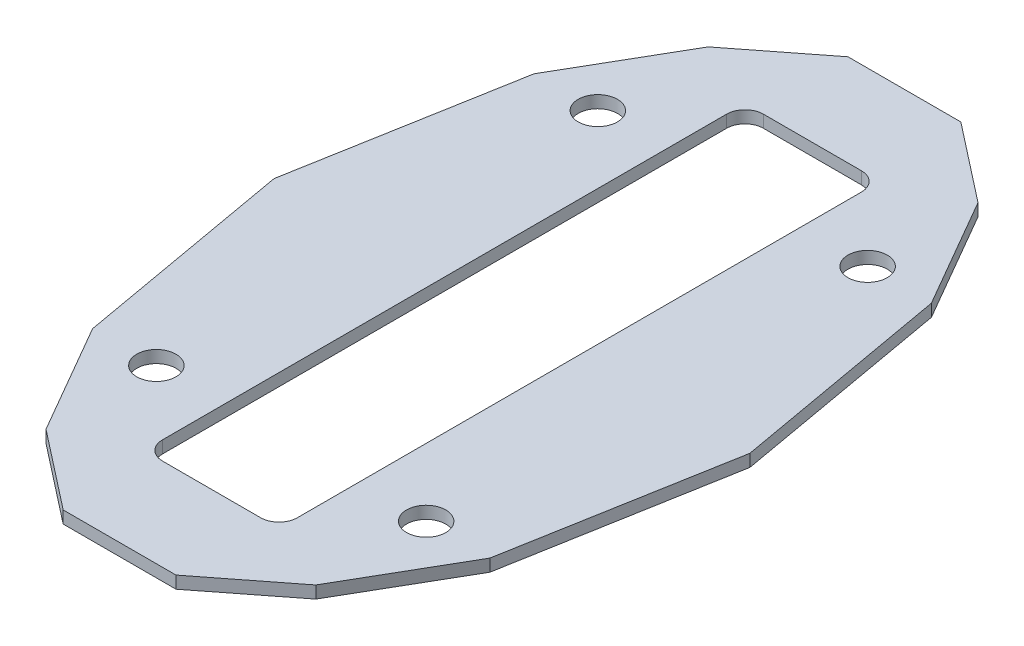
ISO-10303-21;
HEADER;
FILE_DESCRIPTION(('STEP AP214'),'2;1');
FILE_NAME('part.step','',(''),(''),'','','');
FILE_SCHEMA(('AUTOMOTIVE_DESIGN { 1 0 10303 214 1 1 1 1 }'));
ENDSEC;
DATA;
#1=APPLICATION_CONTEXT('core data for automotive mechanical design processes');
#2=APPLICATION_PROTOCOL_DEFINITION('international standard','automotive_design',2000,#1);
#3=PRODUCT_CONTEXT('',#1,'mechanical');
#4=PRODUCT('Part','Part','',(#3));
#5=PRODUCT_RELATED_PRODUCT_CATEGORY('part','',(#4));
#6=PRODUCT_DEFINITION_FORMATION('','',#4);
#7=PRODUCT_DEFINITION_CONTEXT('part definition',#1,'design');
#8=PRODUCT_DEFINITION('design','',#6,#7);
#9=PRODUCT_DEFINITION_SHAPE('','',#8);
#10=(LENGTH_UNIT() NAMED_UNIT(*) SI_UNIT(.MILLI.,.METRE.));
#11=(NAMED_UNIT(*) PLANE_ANGLE_UNIT() SI_UNIT($,.RADIAN.));
#12=(NAMED_UNIT(*) SI_UNIT($,.STERADIAN.) SOLID_ANGLE_UNIT());
#13=UNCERTAINTY_MEASURE_WITH_UNIT(LENGTH_MEASURE(1.E-05),#10,'distance_accuracy_value','');
#14=(GEOMETRIC_REPRESENTATION_CONTEXT(3) GLOBAL_UNCERTAINTY_ASSIGNED_CONTEXT((#13)) GLOBAL_UNIT_ASSIGNED_CONTEXT((#10,
#11,#12)) REPRESENTATION_CONTEXT('',''));
#15=CARTESIAN_POINT('',(0.,0.,0.));
#16=DIRECTION('',(0.,0.,1.));
#17=DIRECTION('',(1.,0.,0.));
#18=AXIS2_PLACEMENT_3D('',#15,#16,#17);
#19=CARTESIAN_POINT('',(19.4,1.,0.));
#20=DIRECTION('',(-0.984562507785907,0.,-0.175033334717494));
#21=DIRECTION('',(-0.175033334717494,0.,0.984562507785907));
#22=AXIS2_PLACEMENT_3D('',#19,#20,#21);
#23=PLANE('',#22);
#24=DIRECTION('',(0.175033334717494,0.,-0.984562507785907));
#25=VECTOR('',#24,1.);
#26=CARTESIAN_POINT('',(19.4,0.,0.));
#27=LINE('',#26,#25);
#28=CARTESIAN_POINT('',(16.2,0.,18.));
#29=VERTEX_POINT('',#28);
#30=CARTESIAN_POINT('',(19.4,0.,0.));
#31=VERTEX_POINT('',#30);
#32=EDGE_CURVE('E206',#29,#31,#27,.T.);
#33=ORIENTED_EDGE('',*,*,#32,.T.);
#34=DIRECTION('',(0.,-1.,0.));
#35=VECTOR('',#34,1.);
#36=CARTESIAN_POINT('',(19.4,1.,0.));
#37=LINE('',#36,#35);
#38=CARTESIAN_POINT('',(19.4,1.,0.));
#39=VERTEX_POINT('',#38);
#40=EDGE_CURVE('E187',#39,#31,#37,.T.);
#41=ORIENTED_EDGE('',*,*,#40,.F.);
#42=DIRECTION('',(0.175033334717494,0.,-0.984562507785907));
#43=VECTOR('',#42,1.);
#44=CARTESIAN_POINT('',(19.4,1.,0.));
#45=LINE('',#44,#43);
#46=CARTESIAN_POINT('',(16.2,1.,18.));
#47=VERTEX_POINT('',#46);
#48=EDGE_CURVE('E194',#47,#39,#45,.T.);
#49=ORIENTED_EDGE('',*,*,#48,.F.);
#50=DIRECTION('',(0.,-1.,0.));
#51=VECTOR('',#50,1.);
#52=CARTESIAN_POINT('',(16.2,1.,18.));
#53=LINE('',#52,#51);
#54=EDGE_CURVE('E300',#47,#29,#53,.T.);
#55=ORIENTED_EDGE('',*,*,#54,.T.);
#56=EDGE_LOOP('',(#33,#41,#49,#55));
#57=FACE_BOUND('',#56,.T.);
#58=ADVANCED_FACE('F34',(#57),#23,.F.);
#59=CARTESIAN_POINT('',(19.4,1.,0.));
#60=DIRECTION('',(-0.984562507785907,0.,0.175033334717494));
#61=DIRECTION('',(0.175033334717494,0.,0.984562507785907));
#62=AXIS2_PLACEMENT_3D('',#59,#60,#61);
#63=PLANE('',#62);
#64=DIRECTION('',(-0.175033334717494,0.,-0.984562507785907));
#65=VECTOR('',#64,1.);
#66=CARTESIAN_POINT('',(19.4,0.,0.));
#67=LINE('',#66,#65);
#68=CARTESIAN_POINT('',(16.2,0.,-18.));
#69=VERTEX_POINT('',#68);
#70=EDGE_CURVE('E302',#31,#69,#67,.T.);
#71=ORIENTED_EDGE('',*,*,#70,.T.);
#72=DIRECTION('',(0.,-1.,0.));
#73=VECTOR('',#72,1.);
#74=CARTESIAN_POINT('',(16.2,1.,-18.));
#75=LINE('',#74,#73);
#76=CARTESIAN_POINT('',(16.2,1.,-18.));
#77=VERTEX_POINT('',#76);
#78=EDGE_CURVE('E190',#77,#69,#75,.T.);
#79=ORIENTED_EDGE('',*,*,#78,.F.);
#80=DIRECTION('',(-0.175033334717494,0.,-0.984562507785907));
#81=VECTOR('',#80,1.);
#82=CARTESIAN_POINT('',(19.4,1.,0.));
#83=LINE('',#82,#81);
#84=EDGE_CURVE('E183',#39,#77,#83,.T.);
#85=ORIENTED_EDGE('',*,*,#84,.F.);
#86=ORIENTED_EDGE('',*,*,#40,.T.);
#87=EDGE_LOOP('',(#71,#79,#85,#86));
#88=FACE_BOUND('',#87,.T.);
#89=ADVANCED_FACE('F185',(#88),#63,.F.);
#90=CARTESIAN_POINT('',(16.2,1.,-18.));
#91=DIRECTION('',(-0.86586507324455,0.,0.50027759787463));
#92=DIRECTION('',(0.50027759787463,0.,0.86586507324455));
#93=AXIS2_PLACEMENT_3D('',#90,#91,#92);
#94=PLANE('',#93);
#95=DIRECTION('',(-0.50027759787463,0.,-0.86586507324455));
#96=VECTOR('',#95,1.);
#97=CARTESIAN_POINT('',(16.2,0.,-18.));
#98=LINE('',#97,#96);
#99=CARTESIAN_POINT('',(11.,0.,-27.));
#100=VERTEX_POINT('',#99);
#101=EDGE_CURVE('E304',#69,#100,#98,.T.);
#102=ORIENTED_EDGE('',*,*,#101,.T.);
#103=DIRECTION('',(0.,-1.,0.));
#104=VECTOR('',#103,1.);
#105=CARTESIAN_POINT('',(11.,1.,-27.));
#106=LINE('',#105,#104);
#107=CARTESIAN_POINT('',(11.,1.,-27.));
#108=VERTEX_POINT('',#107);
#109=EDGE_CURVE('E211',#108,#100,#106,.T.);
#110=ORIENTED_EDGE('',*,*,#109,.F.);
#111=DIRECTION('',(-0.50027759787463,0.,-0.86586507324455));
#112=VECTOR('',#111,1.);
#113=CARTESIAN_POINT('',(16.2,1.,-18.));
#114=LINE('',#113,#112);
#115=EDGE_CURVE('E193',#77,#108,#114,.T.);
#116=ORIENTED_EDGE('',*,*,#115,.F.);
#117=ORIENTED_EDGE('',*,*,#78,.T.);
#118=EDGE_LOOP('',(#102,#110,#116,#117));
#119=FACE_BOUND('',#118,.T.);
#120=ADVANCED_FACE('F381',(#119),#94,.F.);
#121=CARTESIAN_POINT('',(11.,1.,-27.));
#122=DIRECTION('',(-0.615644041972315,0.,0.788024373724563));
#123=DIRECTION('',(0.788024373724563,0.,0.615644041972315));
#124=AXIS2_PLACEMENT_3D('',#121,#122,#123);
#125=PLANE('',#124);
#126=DIRECTION('',(-0.788024373724563,0.,-0.615644041972315));
#127=VECTOR('',#126,1.);
#128=CARTESIAN_POINT('',(11.,0.,-27.));
#129=LINE('',#128,#127);
#130=CARTESIAN_POINT('',(4.6,0.,-32.));
#131=VERTEX_POINT('',#130);
#132=EDGE_CURVE('E306',#100,#131,#129,.T.);
#133=ORIENTED_EDGE('',*,*,#132,.T.);
#134=DIRECTION('',(0.,-1.,0.));
#135=VECTOR('',#134,1.);
#136=CARTESIAN_POINT('',(4.6,1.,-32.));
#137=LINE('',#136,#135);
#138=CARTESIAN_POINT('',(4.6,1.,-32.));
#139=VERTEX_POINT('',#138);
#140=EDGE_CURVE('E355',#139,#131,#137,.T.);
#141=ORIENTED_EDGE('',*,*,#140,.F.);
#142=DIRECTION('',(-0.788024373724563,0.,-0.615644041972315));
#143=VECTOR('',#142,1.);
#144=CARTESIAN_POINT('',(11.,1.,-27.));
#145=LINE('',#144,#143);
#146=EDGE_CURVE('E279',#108,#139,#145,.T.);
#147=ORIENTED_EDGE('',*,*,#146,.F.);
#148=ORIENTED_EDGE('',*,*,#109,.T.);
#149=EDGE_LOOP('',(#133,#141,#147,#148));
#150=FACE_BOUND('',#149,.T.);
#151=ADVANCED_FACE('F362',(#150),#125,.F.);
#152=CARTESIAN_POINT('',(4.6,1.,-32.));
#153=DIRECTION('',(0.,0.,1.));
#154=DIRECTION('',(1.,0.,0.));
#155=AXIS2_PLACEMENT_3D('',#152,#153,#154);
#156=PLANE('',#155);
#157=DIRECTION('',(-1.,0.,0.));
#158=VECTOR('',#157,1.);
#159=CARTESIAN_POINT('',(4.6,0.,-32.));
#160=LINE('',#159,#158);
#161=CARTESIAN_POINT('',(-4.6,0.,-32.));
#162=VERTEX_POINT('',#161);
#163=EDGE_CURVE('E308',#131,#162,#160,.T.);
#164=ORIENTED_EDGE('',*,*,#163,.T.);
#165=DIRECTION('',(0.,-1.,0.));
#166=VECTOR('',#165,1.);
#167=CARTESIAN_POINT('',(-4.6,1.,-32.));
#168=LINE('',#167,#166);
#169=CARTESIAN_POINT('',(-4.6,1.,-32.));
#170=VERTEX_POINT('',#169);
#171=EDGE_CURVE('E352',#170,#162,#168,.T.);
#172=ORIENTED_EDGE('',*,*,#171,.F.);
#173=DIRECTION('',(-1.,0.,0.));
#174=VECTOR('',#173,1.);
#175=CARTESIAN_POINT('',(4.6,1.,-32.));
#176=LINE('',#175,#174);
#177=EDGE_CURVE('E281',#139,#170,#176,.T.);
#178=ORIENTED_EDGE('',*,*,#177,.F.);
#179=ORIENTED_EDGE('',*,*,#140,.T.);
#180=EDGE_LOOP('',(#164,#172,#178,#179));
#181=FACE_BOUND('',#180,.T.);
#182=ADVANCED_FACE('F373',(#181),#156,.F.);
#183=CARTESIAN_POINT('',(-11.,1.,-27.));
#184=DIRECTION('',(0.615644041972315,0.,0.788024373724563));
#185=DIRECTION('',(0.788024373724563,0.,-0.615644041972315));
#186=AXIS2_PLACEMENT_3D('',#183,#184,#185);
#187=PLANE('',#186);
#188=DIRECTION('',(-0.788024373724563,0.,0.615644041972315));
#189=VECTOR('',#188,1.);
#190=CARTESIAN_POINT('',(-11.,0.,-27.));
#191=LINE('',#190,#189);
#192=CARTESIAN_POINT('',(-11.,0.,-27.));
#193=VERTEX_POINT('',#192);
#194=EDGE_CURVE('E310',#162,#193,#191,.T.);
#195=ORIENTED_EDGE('',*,*,#194,.T.);
#196=DIRECTION('',(0.,-1.,0.));
#197=VECTOR('',#196,1.);
#198=CARTESIAN_POINT('',(-11.,1.,-27.));
#199=LINE('',#198,#197);
#200=CARTESIAN_POINT('',(-11.,1.,-27.));
#201=VERTEX_POINT('',#200);
#202=EDGE_CURVE('E349',#201,#193,#199,.T.);
#203=ORIENTED_EDGE('',*,*,#202,.F.);
#204=DIRECTION('',(-0.788024373724563,0.,0.615644041972315));
#205=VECTOR('',#204,1.);
#206=CARTESIAN_POINT('',(-11.,1.,-27.));
#207=LINE('',#206,#205);
#208=EDGE_CURVE('E283',#170,#201,#207,.T.);
#209=ORIENTED_EDGE('',*,*,#208,.F.);
#210=ORIENTED_EDGE('',*,*,#171,.T.);
#211=EDGE_LOOP('',(#195,#203,#209,#210));
#212=FACE_BOUND('',#211,.T.);
#213=ADVANCED_FACE('F377',(#212),#187,.F.);
#214=CARTESIAN_POINT('',(-16.2,1.,-18.));
#215=DIRECTION('',(0.86586507324455,0.,0.50027759787463));
#216=DIRECTION('',(0.50027759787463,0.,-0.86586507324455));
#217=AXIS2_PLACEMENT_3D('',#214,#215,#216);
#218=PLANE('',#217);
#219=DIRECTION('',(-0.50027759787463,0.,0.86586507324455));
#220=VECTOR('',#219,1.);
#221=CARTESIAN_POINT('',(-16.2,0.,-18.));
#222=LINE('',#221,#220);
#223=CARTESIAN_POINT('',(-16.2,0.,-18.));
#224=VERTEX_POINT('',#223);
#225=EDGE_CURVE('E312',#193,#224,#222,.T.);
#226=ORIENTED_EDGE('',*,*,#225,.T.);
#227=DIRECTION('',(0.,-1.,0.));
#228=VECTOR('',#227,1.);
#229=CARTESIAN_POINT('',(-16.2,1.,-18.));
#230=LINE('',#229,#228);
#231=CARTESIAN_POINT('',(-16.2,1.,-18.));
#232=VERTEX_POINT('',#231);
#233=EDGE_CURVE('E346',#232,#224,#230,.T.);
#234=ORIENTED_EDGE('',*,*,#233,.F.);
#235=DIRECTION('',(-0.50027759787463,0.,0.86586507324455));
#236=VECTOR('',#235,1.);
#237=CARTESIAN_POINT('',(-16.2,1.,-18.));
#238=LINE('',#237,#236);
#239=EDGE_CURVE('E285',#201,#232,#238,.T.);
#240=ORIENTED_EDGE('',*,*,#239,.F.);
#241=ORIENTED_EDGE('',*,*,#202,.T.);
#242=EDGE_LOOP('',(#226,#234,#240,#241));
#243=FACE_BOUND('',#242,.T.);
#244=ADVANCED_FACE('F469',(#243),#218,.F.);
#245=CARTESIAN_POINT('',(-19.4,1.,0.));
#246=DIRECTION('',(0.984562507785907,0.,0.175033334717494));
#247=DIRECTION('',(0.175033334717494,0.,-0.984562507785907));
#248=AXIS2_PLACEMENT_3D('',#245,#246,#247);
#249=PLANE('',#248);
#250=DIRECTION('',(-0.175033334717494,0.,0.984562507785907));
#251=VECTOR('',#250,1.);
#252=CARTESIAN_POINT('',(-19.4,0.,0.));
#253=LINE('',#252,#251);
#254=CARTESIAN_POINT('',(-19.4,0.,0.));
#255=VERTEX_POINT('',#254);
#256=EDGE_CURVE('E314',#224,#255,#253,.T.);
#257=ORIENTED_EDGE('',*,*,#256,.T.);
#258=DIRECTION('',(0.,-1.,0.));
#259=VECTOR('',#258,1.);
#260=CARTESIAN_POINT('',(-19.4,1.,0.));
#261=LINE('',#260,#259);
#262=CARTESIAN_POINT('',(-19.4,1.,0.));
#263=VERTEX_POINT('',#262);
#264=EDGE_CURVE('E343',#263,#255,#261,.T.);
#265=ORIENTED_EDGE('',*,*,#264,.F.);
#266=DIRECTION('',(-0.175033334717494,0.,0.984562507785907));
#267=VECTOR('',#266,1.);
#268=CARTESIAN_POINT('',(-19.4,1.,0.));
#269=LINE('',#268,#267);
#270=EDGE_CURVE('E287',#232,#263,#269,.T.);
#271=ORIENTED_EDGE('',*,*,#270,.F.);
#272=ORIENTED_EDGE('',*,*,#233,.T.);
#273=EDGE_LOOP('',(#257,#265,#271,#272));
#274=FACE_BOUND('',#273,.T.);
#275=ADVANCED_FACE('F465',(#274),#249,.F.);
#276=CARTESIAN_POINT('',(-19.4,1.,0.));
#277=DIRECTION('',(0.984562507785907,0.,-0.175033334717494));
#278=DIRECTION('',(-0.175033334717494,0.,-0.984562507785907));
#279=AXIS2_PLACEMENT_3D('',#276,#277,#278);
#280=PLANE('',#279);
#281=DIRECTION('',(0.175033334717494,0.,0.984562507785907));
#282=VECTOR('',#281,1.);
#283=CARTESIAN_POINT('',(-19.4,0.,0.));
#284=LINE('',#283,#282);
#285=CARTESIAN_POINT('',(-16.2,0.,18.));
#286=VERTEX_POINT('',#285);
#287=EDGE_CURVE('E316',#255,#286,#284,.T.);
#288=ORIENTED_EDGE('',*,*,#287,.T.);
#289=DIRECTION('',(0.,-1.,0.));
#290=VECTOR('',#289,1.);
#291=CARTESIAN_POINT('',(-16.2,1.,18.));
#292=LINE('',#291,#290);
#293=CARTESIAN_POINT('',(-16.2,1.,18.));
#294=VERTEX_POINT('',#293);
#295=EDGE_CURVE('E340',#294,#286,#292,.T.);
#296=ORIENTED_EDGE('',*,*,#295,.F.);
#297=DIRECTION('',(0.175033334717494,0.,0.984562507785907));
#298=VECTOR('',#297,1.);
#299=CARTESIAN_POINT('',(-19.4,1.,0.));
#300=LINE('',#299,#298);
#301=EDGE_CURVE('E289',#263,#294,#300,.T.);
#302=ORIENTED_EDGE('',*,*,#301,.F.);
#303=ORIENTED_EDGE('',*,*,#264,.T.);
#304=EDGE_LOOP('',(#288,#296,#302,#303));
#305=FACE_BOUND('',#304,.T.);
#306=ADVANCED_FACE('F461',(#305),#280,.F.);
#307=CARTESIAN_POINT('',(-16.2,1.,18.));
#308=DIRECTION('',(0.86586507324455,0.,-0.50027759787463));
#309=DIRECTION('',(-0.50027759787463,0.,-0.86586507324455));
#310=AXIS2_PLACEMENT_3D('',#307,#308,#309);
#311=PLANE('',#310);
#312=DIRECTION('',(0.50027759787463,0.,0.86586507324455));
#313=VECTOR('',#312,1.);
#314=CARTESIAN_POINT('',(-16.2,0.,18.));
#315=LINE('',#314,#313);
#316=CARTESIAN_POINT('',(-11.,0.,27.));
#317=VERTEX_POINT('',#316);
#318=EDGE_CURVE('E318',#286,#317,#315,.T.);
#319=ORIENTED_EDGE('',*,*,#318,.T.);
#320=DIRECTION('',(0.,-1.,0.));
#321=VECTOR('',#320,1.);
#322=CARTESIAN_POINT('',(-11.,1.,27.));
#323=LINE('',#322,#321);
#324=CARTESIAN_POINT('',(-11.,1.,27.));
#325=VERTEX_POINT('',#324);
#326=EDGE_CURVE('E337',#325,#317,#323,.T.);
#327=ORIENTED_EDGE('',*,*,#326,.F.);
#328=DIRECTION('',(0.50027759787463,0.,0.86586507324455));
#329=VECTOR('',#328,1.);
#330=CARTESIAN_POINT('',(-16.2,1.,18.));
#331=LINE('',#330,#329);
#332=EDGE_CURVE('E291',#294,#325,#331,.T.);
#333=ORIENTED_EDGE('',*,*,#332,.F.);
#334=ORIENTED_EDGE('',*,*,#295,.T.);
#335=EDGE_LOOP('',(#319,#327,#333,#334));
#336=FACE_BOUND('',#335,.T.);
#337=ADVANCED_FACE('F457',(#336),#311,.F.);
#338=CARTESIAN_POINT('',(-11.,1.,27.));
#339=DIRECTION('',(0.615644041972315,0.,-0.788024373724563));
#340=DIRECTION('',(-0.788024373724563,0.,-0.615644041972315));
#341=AXIS2_PLACEMENT_3D('',#338,#339,#340);
#342=PLANE('',#341);
#343=DIRECTION('',(0.788024373724563,0.,0.615644041972315));
#344=VECTOR('',#343,1.);
#345=CARTESIAN_POINT('',(-11.,0.,27.));
#346=LINE('',#345,#344);
#347=CARTESIAN_POINT('',(-4.6,0.,32.));
#348=VERTEX_POINT('',#347);
#349=EDGE_CURVE('E320',#317,#348,#346,.T.);
#350=ORIENTED_EDGE('',*,*,#349,.T.);
#351=DIRECTION('',(0.,-1.,0.));
#352=VECTOR('',#351,1.);
#353=CARTESIAN_POINT('',(-4.6,1.,32.));
#354=LINE('',#353,#352);
#355=CARTESIAN_POINT('',(-4.6,1.,32.));
#356=VERTEX_POINT('',#355);
#357=EDGE_CURVE('E334',#356,#348,#354,.T.);
#358=ORIENTED_EDGE('',*,*,#357,.F.);
#359=DIRECTION('',(0.788024373724563,0.,0.615644041972315));
#360=VECTOR('',#359,1.);
#361=CARTESIAN_POINT('',(-11.,1.,27.));
#362=LINE('',#361,#360);
#363=EDGE_CURVE('E293',#325,#356,#362,.T.);
#364=ORIENTED_EDGE('',*,*,#363,.F.);
#365=ORIENTED_EDGE('',*,*,#326,.T.);
#366=EDGE_LOOP('',(#350,#358,#364,#365));
#367=FACE_BOUND('',#366,.T.);
#368=ADVANCED_FACE('F453',(#367),#342,.F.);
#369=CARTESIAN_POINT('',(4.6,1.,32.));
#370=DIRECTION('',(0.,0.,-1.));
#371=DIRECTION('',(-1.,0.,0.));
#372=AXIS2_PLACEMENT_3D('',#369,#370,#371);
#373=PLANE('',#372);
#374=DIRECTION('',(1.,0.,0.));
#375=VECTOR('',#374,1.);
#376=CARTESIAN_POINT('',(4.6,0.,32.));
#377=LINE('',#376,#375);
#378=CARTESIAN_POINT('',(4.6,0.,32.));
#379=VERTEX_POINT('',#378);
#380=EDGE_CURVE('E322',#348,#379,#377,.T.);
#381=ORIENTED_EDGE('',*,*,#380,.T.);
#382=DIRECTION('',(0.,-1.,0.));
#383=VECTOR('',#382,1.);
#384=CARTESIAN_POINT('',(4.6,1.,32.));
#385=LINE('',#384,#383);
#386=CARTESIAN_POINT('',(4.6,1.,32.));
#387=VERTEX_POINT('',#386);
#388=EDGE_CURVE('E331',#387,#379,#385,.T.);
#389=ORIENTED_EDGE('',*,*,#388,.F.);
#390=DIRECTION('',(1.,0.,0.));
#391=VECTOR('',#390,1.);
#392=CARTESIAN_POINT('',(4.6,1.,32.));
#393=LINE('',#392,#391);
#394=EDGE_CURVE('E295',#356,#387,#393,.T.);
#395=ORIENTED_EDGE('',*,*,#394,.F.);
#396=ORIENTED_EDGE('',*,*,#357,.T.);
#397=EDGE_LOOP('',(#381,#389,#395,#396));
#398=FACE_BOUND('',#397,.T.);
#399=ADVANCED_FACE('F449',(#398),#373,.F.);
#400=CARTESIAN_POINT('',(11.,1.,27.));
#401=DIRECTION('',(-0.615644041972315,0.,-0.788024373724563));
#402=DIRECTION('',(-0.788024373724563,0.,0.615644041972315));
#403=AXIS2_PLACEMENT_3D('',#400,#401,#402);
#404=PLANE('',#403);
#405=DIRECTION('',(0.788024373724563,0.,-0.615644041972315));
#406=VECTOR('',#405,1.);
#407=CARTESIAN_POINT('',(11.,0.,27.));
#408=LINE('',#407,#406);
#409=CARTESIAN_POINT('',(11.,0.,27.));
#410=VERTEX_POINT('',#409);
#411=EDGE_CURVE('E324',#379,#410,#408,.T.);
#412=ORIENTED_EDGE('',*,*,#411,.T.);
#413=DIRECTION('',(0.,-1.,0.));
#414=VECTOR('',#413,1.);
#415=CARTESIAN_POINT('',(11.,1.,27.));
#416=LINE('',#415,#414);
#417=CARTESIAN_POINT('',(11.,1.,27.));
#418=VERTEX_POINT('',#417);
#419=EDGE_CURVE('E328',#418,#410,#416,.T.);
#420=ORIENTED_EDGE('',*,*,#419,.F.);
#421=DIRECTION('',(0.788024373724563,0.,-0.615644041972315));
#422=VECTOR('',#421,1.);
#423=CARTESIAN_POINT('',(11.,1.,27.));
#424=LINE('',#423,#422);
#425=EDGE_CURVE('E297',#387,#418,#424,.T.);
#426=ORIENTED_EDGE('',*,*,#425,.F.);
#427=ORIENTED_EDGE('',*,*,#388,.T.);
#428=EDGE_LOOP('',(#412,#420,#426,#427));
#429=FACE_BOUND('',#428,.T.);
#430=ADVANCED_FACE('F445',(#429),#404,.F.);
#431=CARTESIAN_POINT('',(16.2,1.,18.));
#432=DIRECTION('',(-0.86586507324455,0.,-0.50027759787463));
#433=DIRECTION('',(-0.50027759787463,0.,0.86586507324455));
#434=AXIS2_PLACEMENT_3D('',#431,#432,#433);
#435=PLANE('',#434);
#436=DIRECTION('',(0.50027759787463,0.,-0.86586507324455));
#437=VECTOR('',#436,1.);
#438=CARTESIAN_POINT('',(16.2,0.,18.));
#439=LINE('',#438,#437);
#440=EDGE_CURVE('E203',#410,#29,#439,.T.);
#441=ORIENTED_EDGE('',*,*,#440,.T.);
#442=ORIENTED_EDGE('',*,*,#54,.F.);
#443=DIRECTION('',(0.50027759787463,0.,-0.86586507324455));
#444=VECTOR('',#443,1.);
#445=CARTESIAN_POINT('',(16.2,1.,18.));
#446=LINE('',#445,#444);
#447=EDGE_CURVE('E199',#418,#47,#446,.T.);
#448=ORIENTED_EDGE('',*,*,#447,.F.);
#449=ORIENTED_EDGE('',*,*,#419,.T.);
#450=EDGE_LOOP('',(#441,#442,#448,#449));
#451=FACE_BOUND('',#450,.T.);
#452=ADVANCED_FACE('F438',(#451),#435,.F.);
#453=CARTESIAN_POINT('',(0.,1.,0.));
#454=DIRECTION('',(0.,-1.,0.));
#455=DIRECTION('',(0.,0.,-1.));
#456=AXIS2_PLACEMENT_3D('',#453,#454,#455);
#457=PLANE('',#456);
#458=CARTESIAN_POINT('',(11.,1.,18.));
#459=DIRECTION('',(0.,1.,0.));
#460=DIRECTION('',(0.,0.,1.));
#461=AXIS2_PLACEMENT_3D('',#458,#459,#460);
#462=CIRCLE('',#461,1.6);
#463=CARTESIAN_POINT('',(11.,1.,19.6));
#464=VERTEX_POINT('',#463);
#465=EDGE_CURVE('E619',#464,#464,#462,.T.);
#466=ORIENTED_EDGE('',*,*,#465,.F.);
#467=EDGE_LOOP('',(#466));
#468=FACE_BOUND('',#467,.T.);
#469=CARTESIAN_POINT('',(-11.,1.,18.));
#470=DIRECTION('',(0.,1.,0.));
#471=DIRECTION('',(0.,0.,-1.));
#472=AXIS2_PLACEMENT_3D('',#469,#470,#471);
#473=CIRCLE('',#472,1.6);
#474=CARTESIAN_POINT('',(-11.,1.,16.4));
#475=VERTEX_POINT('',#474);
#476=EDGE_CURVE('E621',#475,#475,#473,.T.);
#477=ORIENTED_EDGE('',*,*,#476,.F.);
#478=EDGE_LOOP('',(#477));
#479=FACE_BOUND('',#478,.T.);
#480=CARTESIAN_POINT('',(11.,1.,-18.));
#481=DIRECTION('',(0.,1.,0.));
#482=DIRECTION('',(0.,0.,-1.));
#483=AXIS2_PLACEMENT_3D('',#480,#481,#482);
#484=CIRCLE('',#483,1.6);
#485=CARTESIAN_POINT('',(11.,1.,-19.6));
#486=VERTEX_POINT('',#485);
#487=EDGE_CURVE('E627',#486,#486,#484,.T.);
#488=ORIENTED_EDGE('',*,*,#487,.F.);
#489=EDGE_LOOP('',(#488));
#490=FACE_BOUND('',#489,.T.);
#491=CARTESIAN_POINT('',(-11.,1.,-18.));
#492=DIRECTION('',(0.,1.,0.));
#493=DIRECTION('',(0.,0.,1.));
#494=AXIS2_PLACEMENT_3D('',#491,#492,#493);
#495=CIRCLE('',#494,1.6);
#496=CARTESIAN_POINT('',(-11.,1.,-16.4));
#497=VERTEX_POINT('',#496);
#498=EDGE_CURVE('E633',#497,#497,#495,.T.);
#499=ORIENTED_EDGE('',*,*,#498,.F.);
#500=EDGE_LOOP('',(#499));
#501=FACE_BOUND('',#500,.T.);
#502=DIRECTION('',(-1.,0.,0.));
#503=VECTOR('',#502,1.);
#504=CARTESIAN_POINT('',(-5.5,1.,-24.5));
#505=LINE('',#504,#503);
#506=CARTESIAN_POINT('',(4.,1.,-24.5));
#507=VERTEX_POINT('',#506);
#508=CARTESIAN_POINT('',(-4.,1.,-24.5));
#509=VERTEX_POINT('',#508);
#510=EDGE_CURVE('E247',#507,#509,#505,.T.);
#511=ORIENTED_EDGE('',*,*,#510,.F.);
#512=CARTESIAN_POINT('',(4.,1.,-23.));
#513=DIRECTION('',(0.,-1.,0.));
#514=DIRECTION('',(0.,0.,-1.));
#515=AXIS2_PLACEMENT_3D('',#512,#513,#514);
#516=CIRCLE('',#515,1.5);
#517=CARTESIAN_POINT('',(5.5,1.,-23.));
#518=VERTEX_POINT('',#517);
#519=EDGE_CURVE('E42',#507,#518,#516,.T.);
#520=ORIENTED_EDGE('',*,*,#519,.T.);
#521=DIRECTION('',(0.,0.,-1.));
#522=VECTOR('',#521,1.);
#523=CARTESIAN_POINT('',(5.5,1.,24.5));
#524=LINE('',#523,#522);
#525=CARTESIAN_POINT('',(5.5,1.,23.));
#526=VERTEX_POINT('',#525);
#527=EDGE_CURVE('E246',#526,#518,#524,.T.);
#528=ORIENTED_EDGE('',*,*,#527,.F.);
#529=CARTESIAN_POINT('',(4.,1.,23.));
#530=DIRECTION('',(0.,-1.,0.));
#531=DIRECTION('',(0.,0.,-1.));
#532=AXIS2_PLACEMENT_3D('',#529,#530,#531);
#533=CIRCLE('',#532,1.5);
#534=CARTESIAN_POINT('',(4.,1.,24.5));
#535=VERTEX_POINT('',#534);
#536=EDGE_CURVE('E231',#526,#535,#533,.T.);
#537=ORIENTED_EDGE('',*,*,#536,.T.);
#538=DIRECTION('',(1.,0.,0.));
#539=VECTOR('',#538,1.);
#540=CARTESIAN_POINT('',(-5.5,1.,24.5));
#541=LINE('',#540,#539);
#542=CARTESIAN_POINT('',(-4.,1.,24.5));
#543=VERTEX_POINT('',#542);
#544=EDGE_CURVE('E266',#543,#535,#541,.T.);
#545=ORIENTED_EDGE('',*,*,#544,.F.);
#546=CARTESIAN_POINT('',(-4.,1.,23.));
#547=DIRECTION('',(0.,-1.,0.));
#548=DIRECTION('',(0.,0.,-1.));
#549=AXIS2_PLACEMENT_3D('',#546,#547,#548);
#550=CIRCLE('',#549,1.5);
#551=CARTESIAN_POINT('',(-5.5,1.,23.));
#552=VERTEX_POINT('',#551);
#553=EDGE_CURVE('E235',#543,#552,#550,.T.);
#554=ORIENTED_EDGE('',*,*,#553,.T.);
#555=DIRECTION('',(0.,0.,1.));
#556=VECTOR('',#555,1.);
#557=CARTESIAN_POINT('',(-5.5,1.,24.5));
#558=LINE('',#557,#556);
#559=CARTESIAN_POINT('',(-5.5,1.,-23.));
#560=VERTEX_POINT('',#559);
#561=EDGE_CURVE('E273',#560,#552,#558,.T.);
#562=ORIENTED_EDGE('',*,*,#561,.F.);
#563=CARTESIAN_POINT('',(-4.,1.,-23.));
#564=DIRECTION('',(0.,-1.,0.));
#565=DIRECTION('',(0.,0.,-1.));
#566=AXIS2_PLACEMENT_3D('',#563,#564,#565);
#567=CIRCLE('',#566,1.5);
#568=EDGE_CURVE('E239',#560,#509,#567,.T.);
#569=ORIENTED_EDGE('',*,*,#568,.T.);
#570=EDGE_LOOP('',(#511,#520,#528,#537,#545,#554,#562,#569));
#571=FACE_BOUND('',#570,.T.);
#572=ORIENTED_EDGE('',*,*,#48,.T.);
#573=ORIENTED_EDGE('',*,*,#84,.T.);
#574=ORIENTED_EDGE('',*,*,#115,.T.);
#575=ORIENTED_EDGE('',*,*,#146,.T.);
#576=ORIENTED_EDGE('',*,*,#177,.T.);
#577=ORIENTED_EDGE('',*,*,#208,.T.);
#578=ORIENTED_EDGE('',*,*,#239,.T.);
#579=ORIENTED_EDGE('',*,*,#270,.T.);
#580=ORIENTED_EDGE('',*,*,#301,.T.);
#581=ORIENTED_EDGE('',*,*,#332,.T.);
#582=ORIENTED_EDGE('',*,*,#363,.T.);
#583=ORIENTED_EDGE('',*,*,#394,.T.);
#584=ORIENTED_EDGE('',*,*,#425,.T.);
#585=ORIENTED_EDGE('',*,*,#447,.T.);
#586=EDGE_LOOP('',(#572,#573,#574,#575,#576,#577,#578,#579,#580,#581,#582,#583,#584,#585));
#587=FACE_BOUND('',#586,.T.);
#588=ADVANCED_FACE('F197',(#468,#479,#490,#501,#571,#587),#457,.F.);
#589=CARTESIAN_POINT('',(0.,0.,0.));
#590=DIRECTION('',(0.,-1.,0.));
#591=DIRECTION('',(0.,0.,-1.));
#592=AXIS2_PLACEMENT_3D('',#589,#590,#591);
#593=PLANE('',#592);
#594=CARTESIAN_POINT('',(11.,0.,18.));
#595=DIRECTION('',(0.,1.,0.));
#596=DIRECTION('',(0.,0.,1.));
#597=AXIS2_PLACEMENT_3D('',#594,#595,#596);
#598=CIRCLE('',#597,1.6);
#599=CARTESIAN_POINT('',(11.,0.,19.6));
#600=VERTEX_POINT('',#599);
#601=EDGE_CURVE('E616',#600,#600,#598,.T.);
#602=ORIENTED_EDGE('',*,*,#601,.T.);
#603=EDGE_LOOP('',(#602));
#604=FACE_BOUND('',#603,.T.);
#605=CARTESIAN_POINT('',(-11.,0.,18.));
#606=DIRECTION('',(0.,1.,0.));
#607=DIRECTION('',(0.,0.,-1.));
#608=AXIS2_PLACEMENT_3D('',#605,#606,#607);
#609=CIRCLE('',#608,1.6);
#610=CARTESIAN_POINT('',(-11.,0.,16.4));
#611=VERTEX_POINT('',#610);
#612=EDGE_CURVE('E624',#611,#611,#609,.T.);
#613=ORIENTED_EDGE('',*,*,#612,.T.);
#614=EDGE_LOOP('',(#613));
#615=FACE_BOUND('',#614,.T.);
#616=CARTESIAN_POINT('',(11.,0.,-18.));
#617=DIRECTION('',(0.,1.,0.));
#618=DIRECTION('',(0.,0.,-1.));
#619=AXIS2_PLACEMENT_3D('',#616,#617,#618);
#620=CIRCLE('',#619,1.6);
#621=CARTESIAN_POINT('',(11.,0.,-19.6));
#622=VERTEX_POINT('',#621);
#623=EDGE_CURVE('E630',#622,#622,#620,.T.);
#624=ORIENTED_EDGE('',*,*,#623,.T.);
#625=EDGE_LOOP('',(#624));
#626=FACE_BOUND('',#625,.T.);
#627=CARTESIAN_POINT('',(-11.,0.,-18.));
#628=DIRECTION('',(0.,1.,0.));
#629=DIRECTION('',(0.,0.,1.));
#630=AXIS2_PLACEMENT_3D('',#627,#628,#629);
#631=CIRCLE('',#630,1.6);
#632=CARTESIAN_POINT('',(-11.,0.,-16.4));
#633=VERTEX_POINT('',#632);
#634=EDGE_CURVE('E255',#633,#633,#631,.T.);
#635=ORIENTED_EDGE('',*,*,#634,.T.);
#636=EDGE_LOOP('',(#635));
#637=FACE_BOUND('',#636,.T.);
#638=DIRECTION('',(1.,0.,0.));
#639=VECTOR('',#638,1.);
#640=CARTESIAN_POINT('',(-5.5,0.,24.5));
#641=LINE('',#640,#639);
#642=CARTESIAN_POINT('',(-4.,0.,24.5));
#643=VERTEX_POINT('',#642);
#644=CARTESIAN_POINT('',(4.,0.,24.5));
#645=VERTEX_POINT('',#644);
#646=EDGE_CURVE('E264',#643,#645,#641,.T.);
#647=ORIENTED_EDGE('',*,*,#646,.T.);
#648=CARTESIAN_POINT('',(4.,0.,23.));
#649=DIRECTION('',(0.,-1.,0.));
#650=DIRECTION('',(0.,0.,-1.));
#651=AXIS2_PLACEMENT_3D('',#648,#649,#650);
#652=CIRCLE('',#651,1.5);
#653=CARTESIAN_POINT('',(5.5,0.,23.));
#654=VERTEX_POINT('',#653);
#655=EDGE_CURVE('E233',#645,#654,#652,.F.);
#656=ORIENTED_EDGE('',*,*,#655,.T.);
#657=DIRECTION('',(0.,0.,-1.));
#658=VECTOR('',#657,1.);
#659=CARTESIAN_POINT('',(5.5,0.,24.5));
#660=LINE('',#659,#658);
#661=CARTESIAN_POINT('',(5.5,0.,-23.));
#662=VERTEX_POINT('',#661);
#663=EDGE_CURVE('E261',#654,#662,#660,.T.);
#664=ORIENTED_EDGE('',*,*,#663,.T.);
#665=CARTESIAN_POINT('',(4.,0.,-23.));
#666=DIRECTION('',(0.,-1.,0.));
#667=DIRECTION('',(0.,0.,-1.));
#668=AXIS2_PLACEMENT_3D('',#665,#666,#667);
#669=CIRCLE('',#668,1.5);
#670=CARTESIAN_POINT('',(4.,0.,-24.5));
#671=VERTEX_POINT('',#670);
#672=EDGE_CURVE('E11',#662,#671,#669,.F.);
#673=ORIENTED_EDGE('',*,*,#672,.T.);
#674=DIRECTION('',(-1.,0.,0.));
#675=VECTOR('',#674,1.);
#676=CARTESIAN_POINT('',(-5.5,0.,-24.5));
#677=LINE('',#676,#675);
#678=CARTESIAN_POINT('',(-4.,0.,-24.5));
#679=VERTEX_POINT('',#678);
#680=EDGE_CURVE('E258',#671,#679,#677,.T.);
#681=ORIENTED_EDGE('',*,*,#680,.T.);
#682=CARTESIAN_POINT('',(-4.,0.,-23.));
#683=DIRECTION('',(0.,-1.,0.));
#684=DIRECTION('',(0.,0.,-1.));
#685=AXIS2_PLACEMENT_3D('',#682,#683,#684);
#686=CIRCLE('',#685,1.5);
#687=CARTESIAN_POINT('',(-5.5,0.,-23.));
#688=VERTEX_POINT('',#687);
#689=EDGE_CURVE('E241',#679,#688,#686,.F.);
#690=ORIENTED_EDGE('',*,*,#689,.T.);
#691=DIRECTION('',(0.,0.,1.));
#692=VECTOR('',#691,1.);
#693=CARTESIAN_POINT('',(-5.5,0.,24.5));
#694=LINE('',#693,#692);
#695=CARTESIAN_POINT('',(-5.5,0.,23.));
#696=VERTEX_POINT('',#695);
#697=EDGE_CURVE('E260',#688,#696,#694,.T.);
#698=ORIENTED_EDGE('',*,*,#697,.T.);
#699=CARTESIAN_POINT('',(-4.,0.,23.));
#700=DIRECTION('',(0.,-1.,0.));
#701=DIRECTION('',(0.,0.,-1.));
#702=AXIS2_PLACEMENT_3D('',#699,#700,#701);
#703=CIRCLE('',#702,1.5);
#704=EDGE_CURVE('E237',#696,#643,#703,.F.);
#705=ORIENTED_EDGE('',*,*,#704,.T.);
#706=EDGE_LOOP('',(#647,#656,#664,#673,#681,#690,#698,#705));
#707=FACE_BOUND('',#706,.T.);
#708=ORIENTED_EDGE('',*,*,#32,.F.);
#709=ORIENTED_EDGE('',*,*,#440,.F.);
#710=ORIENTED_EDGE('',*,*,#411,.F.);
#711=ORIENTED_EDGE('',*,*,#380,.F.);
#712=ORIENTED_EDGE('',*,*,#349,.F.);
#713=ORIENTED_EDGE('',*,*,#318,.F.);
#714=ORIENTED_EDGE('',*,*,#287,.F.);
#715=ORIENTED_EDGE('',*,*,#256,.F.);
#716=ORIENTED_EDGE('',*,*,#225,.F.);
#717=ORIENTED_EDGE('',*,*,#194,.F.);
#718=ORIENTED_EDGE('',*,*,#163,.F.);
#719=ORIENTED_EDGE('',*,*,#132,.F.);
#720=ORIENTED_EDGE('',*,*,#101,.F.);
#721=ORIENTED_EDGE('',*,*,#70,.F.);
#722=EDGE_LOOP('',(#708,#709,#710,#711,#712,#713,#714,#715,#716,#717,#718,#719,#720,#721));
#723=FACE_BOUND('',#722,.T.);
#724=ADVANCED_FACE('F368',(#604,#615,#626,#637,#707,#723),#593,.T.);
#725=CARTESIAN_POINT('',(5.5,0.,24.5));
#726=DIRECTION('',(1.,0.,0.));
#727=DIRECTION('',(0.,0.,-1.));
#728=AXIS2_PLACEMENT_3D('',#725,#726,#727);
#729=PLANE('',#728);
#730=ORIENTED_EDGE('',*,*,#663,.F.);
#731=DIRECTION('',(0.,1.,0.));
#732=VECTOR('',#731,1.);
#733=CARTESIAN_POINT('',(5.5,1.,23.));
#734=LINE('',#733,#732);
#735=EDGE_CURVE('E209',#654,#526,#734,.T.);
#736=ORIENTED_EDGE('',*,*,#735,.T.);
#737=ORIENTED_EDGE('',*,*,#527,.T.);
#738=DIRECTION('',(0.,1.,0.));
#739=VECTOR('',#738,1.);
#740=CARTESIAN_POINT('',(5.5,0.,-23.));
#741=LINE('',#740,#739);
#742=EDGE_CURVE('E207',#518,#662,#741,.F.);
#743=ORIENTED_EDGE('',*,*,#742,.T.);
#744=EDGE_LOOP('',(#730,#736,#737,#743));
#745=FACE_BOUND('',#744,.T.);
#746=ADVANCED_FACE('F253',(#745),#729,.F.);
#747=CARTESIAN_POINT('',(-5.5,0.,24.5));
#748=DIRECTION('',(0.,0.,1.));
#749=DIRECTION('',(1.,0.,0.));
#750=AXIS2_PLACEMENT_3D('',#747,#748,#749);
#751=PLANE('',#750);
#752=ORIENTED_EDGE('',*,*,#544,.T.);
#753=DIRECTION('',(0.,1.,0.));
#754=VECTOR('',#753,1.);
#755=CARTESIAN_POINT('',(4.,0.,24.5));
#756=LINE('',#755,#754);
#757=EDGE_CURVE('E220',#535,#645,#756,.F.);
#758=ORIENTED_EDGE('',*,*,#757,.T.);
#759=ORIENTED_EDGE('',*,*,#646,.F.);
#760=DIRECTION('',(0.,1.,0.));
#761=VECTOR('',#760,1.);
#762=CARTESIAN_POINT('',(-4.,1.,24.5));
#763=LINE('',#762,#761);
#764=EDGE_CURVE('E217',#643,#543,#763,.T.);
#765=ORIENTED_EDGE('',*,*,#764,.T.);
#766=EDGE_LOOP('',(#752,#758,#759,#765));
#767=FACE_BOUND('',#766,.T.);
#768=ADVANCED_FACE('F420',(#767),#751,.F.);
#769=CARTESIAN_POINT('',(-5.5,0.,24.5));
#770=DIRECTION('',(-1.,0.,0.));
#771=DIRECTION('',(0.,0.,1.));
#772=AXIS2_PLACEMENT_3D('',#769,#770,#771);
#773=PLANE('',#772);
#774=ORIENTED_EDGE('',*,*,#561,.T.);
#775=DIRECTION('',(0.,1.,0.));
#776=VECTOR('',#775,1.);
#777=CARTESIAN_POINT('',(-5.5,0.,23.));
#778=LINE('',#777,#776);
#779=EDGE_CURVE('E225',#552,#696,#778,.F.);
#780=ORIENTED_EDGE('',*,*,#779,.T.);
#781=ORIENTED_EDGE('',*,*,#697,.F.);
#782=DIRECTION('',(0.,1.,0.));
#783=VECTOR('',#782,1.);
#784=CARTESIAN_POINT('',(-5.5,1.,-23.));
#785=LINE('',#784,#783);
#786=EDGE_CURVE('E222',#688,#560,#785,.T.);
#787=ORIENTED_EDGE('',*,*,#786,.T.);
#788=EDGE_LOOP('',(#774,#780,#781,#787));
#789=FACE_BOUND('',#788,.T.);
#790=ADVANCED_FACE('F413',(#789),#773,.F.);
#791=CARTESIAN_POINT('',(-5.5,0.,-24.5));
#792=DIRECTION('',(0.,0.,-1.));
#793=DIRECTION('',(-1.,0.,0.));
#794=AXIS2_PLACEMENT_3D('',#791,#792,#793);
#795=PLANE('',#794);
#796=ORIENTED_EDGE('',*,*,#510,.T.);
#797=DIRECTION('',(0.,1.,0.));
#798=VECTOR('',#797,1.);
#799=CARTESIAN_POINT('',(-4.,0.,-24.5));
#800=LINE('',#799,#798);
#801=EDGE_CURVE('E49',#509,#679,#800,.F.);
#802=ORIENTED_EDGE('',*,*,#801,.T.);
#803=ORIENTED_EDGE('',*,*,#680,.F.);
#804=DIRECTION('',(0.,1.,0.));
#805=VECTOR('',#804,1.);
#806=CARTESIAN_POINT('',(4.,1.,-24.5));
#807=LINE('',#806,#805);
#808=EDGE_CURVE('E227',#671,#507,#807,.T.);
#809=ORIENTED_EDGE('',*,*,#808,.T.);
#810=EDGE_LOOP('',(#796,#802,#803,#809));
#811=FACE_BOUND('',#810,.T.);
#812=ADVANCED_FACE('F257',(#811),#795,.F.);
#813=CARTESIAN_POINT('',(4.,0.,23.));
#814=DIRECTION('',(0.,-1.,0.));
#815=DIRECTION('',(0.,0.,-1.));
#816=AXIS2_PLACEMENT_3D('',#813,#814,#815);
#817=CYLINDRICAL_SURFACE('',#816,1.5);
#818=ORIENTED_EDGE('',*,*,#655,.F.);
#819=ORIENTED_EDGE('',*,*,#757,.F.);
#820=ORIENTED_EDGE('',*,*,#536,.F.);
#821=ORIENTED_EDGE('',*,*,#735,.F.);
#822=EDGE_LOOP('',(#818,#819,#820,#821));
#823=FACE_BOUND('',#822,.T.);
#824=ADVANCED_FACE('F395',(#823),#817,.F.);
#825=CARTESIAN_POINT('',(-4.,0.,23.));
#826=DIRECTION('',(0.,-1.,0.));
#827=DIRECTION('',(0.,0.,-1.));
#828=AXIS2_PLACEMENT_3D('',#825,#826,#827);
#829=CYLINDRICAL_SURFACE('',#828,1.5);
#830=ORIENTED_EDGE('',*,*,#704,.F.);
#831=ORIENTED_EDGE('',*,*,#779,.F.);
#832=ORIENTED_EDGE('',*,*,#553,.F.);
#833=ORIENTED_EDGE('',*,*,#764,.F.);
#834=EDGE_LOOP('',(#830,#831,#832,#833));
#835=FACE_BOUND('',#834,.T.);
#836=ADVANCED_FACE('F398',(#835),#829,.F.);
#837=CARTESIAN_POINT('',(-4.,0.,-23.));
#838=DIRECTION('',(0.,-1.,0.));
#839=DIRECTION('',(0.,0.,-1.));
#840=AXIS2_PLACEMENT_3D('',#837,#838,#839);
#841=CYLINDRICAL_SURFACE('',#840,1.5);
#842=ORIENTED_EDGE('',*,*,#689,.F.);
#843=ORIENTED_EDGE('',*,*,#801,.F.);
#844=ORIENTED_EDGE('',*,*,#568,.F.);
#845=ORIENTED_EDGE('',*,*,#786,.F.);
#846=EDGE_LOOP('',(#842,#843,#844,#845));
#847=FACE_BOUND('',#846,.T.);
#848=ADVANCED_FACE('F401',(#847),#841,.F.);
#849=CARTESIAN_POINT('',(4.,0.,-23.));
#850=DIRECTION('',(0.,-1.,0.));
#851=DIRECTION('',(0.,0.,-1.));
#852=AXIS2_PLACEMENT_3D('',#849,#850,#851);
#853=CYLINDRICAL_SURFACE('',#852,1.5);
#854=ORIENTED_EDGE('',*,*,#672,.F.);
#855=ORIENTED_EDGE('',*,*,#742,.F.);
#856=ORIENTED_EDGE('',*,*,#519,.F.);
#857=ORIENTED_EDGE('',*,*,#808,.F.);
#858=EDGE_LOOP('',(#854,#855,#856,#857));
#859=FACE_BOUND('',#858,.T.);
#860=ADVANCED_FACE('F36',(#859),#853,.F.);
#861=CARTESIAN_POINT('',(-11.,0.,-18.));
#862=DIRECTION('',(0.,1.,0.));
#863=DIRECTION('',(0.,0.,1.));
#864=AXIS2_PLACEMENT_3D('',#861,#862,#863);
#865=CYLINDRICAL_SURFACE('',#864,1.6);
#866=ORIENTED_EDGE('',*,*,#634,.F.);
#867=EDGE_LOOP('',(#866));
#868=FACE_BOUND('',#867,.T.);
#869=ORIENTED_EDGE('',*,*,#498,.T.);
#870=EDGE_LOOP('',(#869));
#871=FACE_BOUND('',#870,.T.);
#872=ADVANCED_FACE('F408',(#868,#871),#865,.F.);
#873=CARTESIAN_POINT('',(11.,0.,-18.));
#874=DIRECTION('',(0.,1.,0.));
#875=DIRECTION('',(0.,0.,1.));
#876=AXIS2_PLACEMENT_3D('',#873,#874,#875);
#877=CYLINDRICAL_SURFACE('',#876,1.6);
#878=ORIENTED_EDGE('',*,*,#623,.F.);
#879=EDGE_LOOP('',(#878));
#880=FACE_BOUND('',#879,.T.);
#881=ORIENTED_EDGE('',*,*,#487,.T.);
#882=EDGE_LOOP('',(#881));
#883=FACE_BOUND('',#882,.T.);
#884=ADVANCED_FACE('F581',(#880,#883),#877,.F.);
#885=CARTESIAN_POINT('',(-11.,0.,18.));
#886=DIRECTION('',(0.,1.,0.));
#887=DIRECTION('',(0.,0.,1.));
#888=AXIS2_PLACEMENT_3D('',#885,#886,#887);
#889=CYLINDRICAL_SURFACE('',#888,1.6);
#890=ORIENTED_EDGE('',*,*,#612,.F.);
#891=EDGE_LOOP('',(#890));
#892=FACE_BOUND('',#891,.T.);
#893=ORIENTED_EDGE('',*,*,#476,.T.);
#894=EDGE_LOOP('',(#893));
#895=FACE_BOUND('',#894,.T.);
#896=ADVANCED_FACE('F587',(#892,#895),#889,.F.);
#897=CARTESIAN_POINT('',(11.,0.,18.));
#898=DIRECTION('',(0.,1.,0.));
#899=DIRECTION('',(0.,0.,1.));
#900=AXIS2_PLACEMENT_3D('',#897,#898,#899);
#901=CYLINDRICAL_SURFACE('',#900,1.6);
#902=ORIENTED_EDGE('',*,*,#601,.F.);
#903=EDGE_LOOP('',(#902));
#904=FACE_BOUND('',#903,.T.);
#905=ORIENTED_EDGE('',*,*,#465,.T.);
#906=EDGE_LOOP('',(#905));
#907=FACE_BOUND('',#906,.T.);
#908=ADVANCED_FACE('F594',(#904,#907),#901,.F.);
#909=CLOSED_SHELL('',(#58,#89,#120,#151,#182,#213,#244,#275,#306,#337,#368,#399,#430,#452,#588,
#724,#746,#768,#790,#812,#824,#836,#848,#860,#872,#884,#896,#908));
#910=MANIFOLD_SOLID_BREP('B2',#909);
#911=ADVANCED_BREP_SHAPE_REPRESENTATION('',(#18,#910),#14);
#912=SHAPE_DEFINITION_REPRESENTATION(#9,#911);
ENDSEC;
END-ISO-10303-21;
